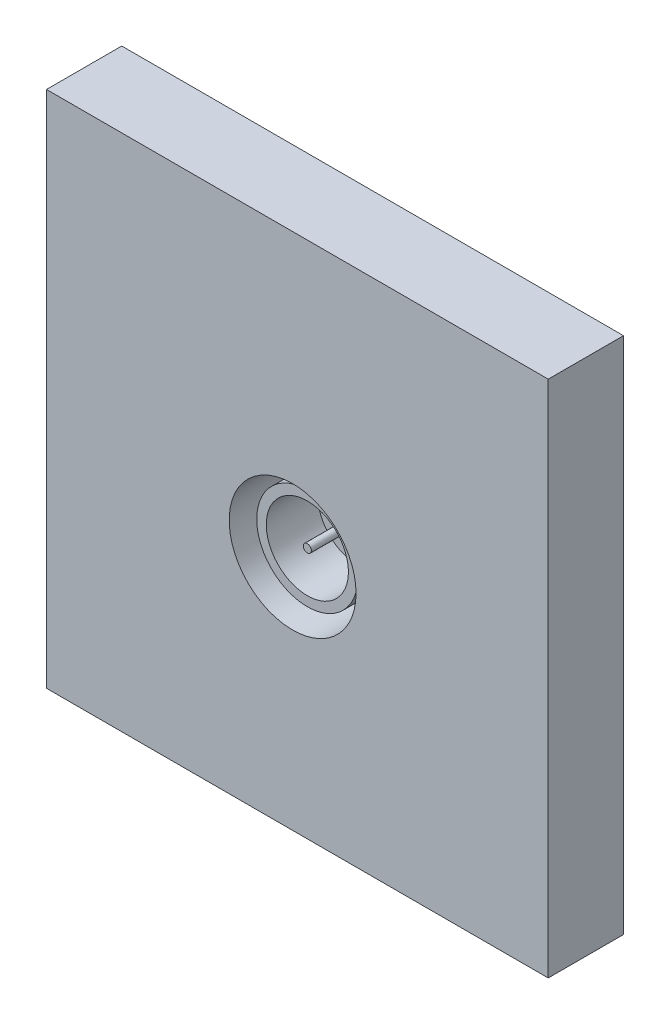
ISO-10303-21;
HEADER;
FILE_DESCRIPTION(('STEP AP214'),'2;1');
FILE_NAME('part.step','',(''),(''),'','','');
FILE_SCHEMA(('AUTOMOTIVE_DESIGN { 1 0 10303 214 1 1 1 1 }'));
ENDSEC;
DATA;
#1=APPLICATION_CONTEXT('core data for automotive mechanical design processes');
#2=APPLICATION_PROTOCOL_DEFINITION('international standard','automotive_design',2000,#1);
#3=PRODUCT_CONTEXT('',#1,'mechanical');
#4=PRODUCT('Part','Part','',(#3));
#5=PRODUCT_RELATED_PRODUCT_CATEGORY('part','',(#4));
#6=PRODUCT_DEFINITION_FORMATION('','',#4);
#7=PRODUCT_DEFINITION_CONTEXT('part definition',#1,'design');
#8=PRODUCT_DEFINITION('design','',#6,#7);
#9=PRODUCT_DEFINITION_SHAPE('','',#8);
#10=(LENGTH_UNIT() NAMED_UNIT(*) SI_UNIT(.MILLI.,.METRE.));
#11=(NAMED_UNIT(*) PLANE_ANGLE_UNIT() SI_UNIT($,.RADIAN.));
#12=(NAMED_UNIT(*) SI_UNIT($,.STERADIAN.) SOLID_ANGLE_UNIT());
#13=UNCERTAINTY_MEASURE_WITH_UNIT(LENGTH_MEASURE(1.E-05),#10,'distance_accuracy_value','');
#14=(GEOMETRIC_REPRESENTATION_CONTEXT(3) GLOBAL_UNCERTAINTY_ASSIGNED_CONTEXT((#13)) GLOBAL_UNIT_ASSIGNED_CONTEXT((#10,
#11,#12)) REPRESENTATION_CONTEXT('',''));
#15=CARTESIAN_POINT('',(0.,0.,0.));
#16=DIRECTION('',(0.,0.,1.));
#17=DIRECTION('',(1.,0.,0.));
#18=AXIS2_PLACEMENT_3D('',#15,#16,#17);
#19=CARTESIAN_POINT('',(-4329.,-6167.65165651162,943.51077616825));
#20=DIRECTION('',(0.,0.,1.));
#21=DIRECTION('',(1.,0.,0.));
#22=AXIS2_PLACEMENT_3D('',#19,#20,#21);
#23=PLANE('',#22);
#24=CARTESIAN_POINT('',(833.930631375601,-1197.16637306014,943.51077616825));
#25=DIRECTION('',(0.,0.,1.));
#26=DIRECTION('',(1.,0.,0.));
#27=AXIS2_PLACEMENT_3D('',#24,#25,#26);
#28=CIRCLE('',#27,1330.44932834744);
#29=CARTESIAN_POINT('',(2164.37995972304,-1197.16637306014,943.51077616825));
#30=VERTEX_POINT('',#29);
#31=EDGE_CURVE('E113',#30,#30,#28,.T.);
#32=ORIENTED_EDGE('',*,*,#31,.F.);
#33=EDGE_LOOP('',(#32));
#34=FACE_BOUND('',#33,.T.);
#35=DIRECTION('',(1.,0.,0.));
#36=VECTOR('',#35,1.);
#37=CARTESIAN_POINT('',(-4329.,-6167.65165651162,943.51077616825));
#38=LINE('',#37,#36);
#39=CARTESIAN_POINT('',(-4329.,-6167.65165651162,943.51077616825));
#40=VERTEX_POINT('',#39);
#41=CARTESIAN_POINT('',(6196.,-6167.65165651162,943.51077616825));
#42=VERTEX_POINT('',#41);
#43=EDGE_CURVE('E88',#40,#42,#38,.T.);
#44=ORIENTED_EDGE('',*,*,#43,.T.);
#45=DIRECTION('',(0.,-1.,0.));
#46=VECTOR('',#45,1.);
#47=CARTESIAN_POINT('',(6196.,-6167.65165651162,943.51077616825));
#48=LINE('',#47,#46);
#49=CARTESIAN_POINT('',(6196.,4711.30994980544,943.51077616825));
#50=VERTEX_POINT('',#49);
#51=EDGE_CURVE('E91',#50,#42,#48,.T.);
#52=ORIENTED_EDGE('',*,*,#51,.F.);
#53=DIRECTION('',(1.,0.,0.));
#54=VECTOR('',#53,1.);
#55=CARTESIAN_POINT('',(-4329.,4711.30994980544,943.51077616825));
#56=LINE('',#55,#54);
#57=CARTESIAN_POINT('',(-4329.,4711.30994980544,943.51077616825));
#58=VERTEX_POINT('',#57);
#59=EDGE_CURVE('E63',#58,#50,#56,.T.);
#60=ORIENTED_EDGE('',*,*,#59,.F.);
#61=DIRECTION('',(0.,-1.,0.));
#62=VECTOR('',#61,1.);
#63=CARTESIAN_POINT('',(-4329.,-6167.65165651162,943.51077616825));
#64=LINE('',#63,#62);
#65=EDGE_CURVE('E92',#58,#40,#64,.T.);
#66=ORIENTED_EDGE('',*,*,#65,.T.);
#67=EDGE_LOOP('',(#44,#52,#60,#66));
#68=FACE_BOUND('',#67,.T.);
#69=ADVANCED_FACE('F49',(#34,#68),#23,.T.);
#70=CARTESIAN_POINT('',(-4329.,4711.30994980544,943.51077616825));
#71=DIRECTION('',(0.,1.,0.));
#72=DIRECTION('',(0.,0.,1.));
#73=AXIS2_PLACEMENT_3D('',#70,#71,#72);
#74=PLANE('',#73);
#75=ORIENTED_EDGE('',*,*,#59,.T.);
#76=DIRECTION('',(0.,0.,1.));
#77=VECTOR('',#76,1.);
#78=CARTESIAN_POINT('',(6196.,4711.30994980544,943.51077616825));
#79=LINE('',#78,#77);
#80=CARTESIAN_POINT('',(6196.,4711.30994980544,-635.191200499874));
#81=VERTEX_POINT('',#80);
#82=EDGE_CURVE('E109',#81,#50,#79,.T.);
#83=ORIENTED_EDGE('',*,*,#82,.F.);
#84=DIRECTION('',(1.,0.,0.));
#85=VECTOR('',#84,1.);
#86=CARTESIAN_POINT('',(-4329.,4711.30994980544,-635.191200499874));
#87=LINE('',#86,#85);
#88=CARTESIAN_POINT('',(-4329.,4711.30994980544,-635.191200499874));
#89=VERTEX_POINT('',#88);
#90=EDGE_CURVE('E71',#89,#81,#87,.T.);
#91=ORIENTED_EDGE('',*,*,#90,.F.);
#92=DIRECTION('',(0.,0.,1.));
#93=VECTOR('',#92,1.);
#94=CARTESIAN_POINT('',(-4329.,4711.30994980544,943.51077616825));
#95=LINE('',#94,#93);
#96=EDGE_CURVE('E97',#89,#58,#95,.T.);
#97=ORIENTED_EDGE('',*,*,#96,.T.);
#98=EDGE_LOOP('',(#75,#83,#91,#97));
#99=FACE_BOUND('',#98,.T.);
#100=ADVANCED_FACE('F154',(#99),#74,.T.);
#101=CARTESIAN_POINT('',(-4329.,-6167.65165651162,-635.191200499874));
#102=DIRECTION('',(0.,0.,-1.));
#103=DIRECTION('',(0.,1.,0.));
#104=AXIS2_PLACEMENT_3D('',#101,#102,#103);
#105=PLANE('',#104);
#106=CARTESIAN_POINT('',(833.930631375601,-1197.16637306014,-635.191200499874));
#107=DIRECTION('',(0.,0.,-1.));
#108=DIRECTION('',(0.,1.,0.));
#109=AXIS2_PLACEMENT_3D('',#106,#107,#108);
#110=CIRCLE('',#109,1061.61577267249);
#111=CARTESIAN_POINT('',(833.930631375601,-135.550600387647,-635.191200499874));
#112=VERTEX_POINT('',#111);
#113=EDGE_CURVE('E173',#112,#112,#110,.T.);
#114=ORIENTED_EDGE('',*,*,#113,.F.);
#115=EDGE_LOOP('',(#114));
#116=FACE_BOUND('',#115,.T.);
#117=ORIENTED_EDGE('',*,*,#90,.T.);
#118=DIRECTION('',(0.,1.,0.));
#119=VECTOR('',#118,1.);
#120=CARTESIAN_POINT('',(6196.,-6167.65165651162,-635.191200499874));
#121=LINE('',#120,#119);
#122=CARTESIAN_POINT('',(6196.,-6167.65165651162,-635.191200499874));
#123=VERTEX_POINT('',#122);
#124=EDGE_CURVE('E105',#123,#81,#121,.T.);
#125=ORIENTED_EDGE('',*,*,#124,.F.);
#126=DIRECTION('',(1.,0.,0.));
#127=VECTOR('',#126,1.);
#128=CARTESIAN_POINT('',(-4329.,-6167.65165651162,-635.191200499874));
#129=LINE('',#128,#127);
#130=CARTESIAN_POINT('',(-4329.,-6167.65165651162,-635.191200499874));
#131=VERTEX_POINT('',#130);
#132=EDGE_CURVE('E96',#131,#123,#129,.T.);
#133=ORIENTED_EDGE('',*,*,#132,.F.);
#134=DIRECTION('',(0.,1.,0.));
#135=VECTOR('',#134,1.);
#136=CARTESIAN_POINT('',(-4329.,-6167.65165651162,-635.191200499874));
#137=LINE('',#136,#135);
#138=EDGE_CURVE('E122',#131,#89,#137,.T.);
#139=ORIENTED_EDGE('',*,*,#138,.T.);
#140=EDGE_LOOP('',(#117,#125,#133,#139));
#141=FACE_BOUND('',#140,.T.);
#142=ADVANCED_FACE('F139',(#116,#141),#105,.T.);
#143=CARTESIAN_POINT('',(-4329.,-6167.65165651162,943.51077616825));
#144=DIRECTION('',(0.,-1.,0.));
#145=DIRECTION('',(0.,0.,-1.));
#146=AXIS2_PLACEMENT_3D('',#143,#144,#145);
#147=PLANE('',#146);
#148=ORIENTED_EDGE('',*,*,#132,.T.);
#149=DIRECTION('',(0.,0.,-1.));
#150=VECTOR('',#149,1.);
#151=CARTESIAN_POINT('',(6196.,-6167.65165651162,943.51077616825));
#152=LINE('',#151,#150);
#153=EDGE_CURVE('E100',#42,#123,#152,.T.);
#154=ORIENTED_EDGE('',*,*,#153,.F.);
#155=ORIENTED_EDGE('',*,*,#43,.F.);
#156=DIRECTION('',(0.,0.,-1.));
#157=VECTOR('',#156,1.);
#158=CARTESIAN_POINT('',(-4329.,-6167.65165651162,943.51077616825));
#159=LINE('',#158,#157);
#160=EDGE_CURVE('E120',#40,#131,#159,.T.);
#161=ORIENTED_EDGE('',*,*,#160,.T.);
#162=EDGE_LOOP('',(#148,#154,#155,#161));
#163=FACE_BOUND('',#162,.T.);
#164=ADVANCED_FACE('F101',(#163),#147,.T.);
#165=CARTESIAN_POINT('',(-4329.,0.,0.));
#166=DIRECTION('',(-1.,0.,0.));
#167=DIRECTION('',(0.,0.,1.));
#168=AXIS2_PLACEMENT_3D('',#165,#166,#167);
#169=PLANE('',#168);
#170=ORIENTED_EDGE('',*,*,#65,.F.);
#171=ORIENTED_EDGE('',*,*,#96,.F.);
#172=ORIENTED_EDGE('',*,*,#138,.F.);
#173=ORIENTED_EDGE('',*,*,#160,.F.);
#174=EDGE_LOOP('',(#170,#171,#172,#173));
#175=FACE_BOUND('',#174,.T.);
#176=ADVANCED_FACE('F229',(#175),#169,.T.);
#177=CARTESIAN_POINT('',(6196.,0.,0.));
#178=DIRECTION('',(-1.,0.,0.));
#179=DIRECTION('',(0.,0.,1.));
#180=AXIS2_PLACEMENT_3D('',#177,#178,#179);
#181=PLANE('',#180);
#182=ORIENTED_EDGE('',*,*,#51,.T.);
#183=ORIENTED_EDGE('',*,*,#153,.T.);
#184=ORIENTED_EDGE('',*,*,#124,.T.);
#185=ORIENTED_EDGE('',*,*,#82,.T.);
#186=EDGE_LOOP('',(#182,#183,#184,#185));
#187=FACE_BOUND('',#186,.T.);
#188=ADVANCED_FACE('F108',(#187),#181,.F.);
#189=CARTESIAN_POINT('',(833.930631375601,-1197.16637306014,-440.489223831748));
#190=DIRECTION('',(0.,0.,1.));
#191=DIRECTION('',(1.,0.,0.));
#192=AXIS2_PLACEMENT_3D('',#189,#190,#191);
#193=CYLINDRICAL_SURFACE('',#192,1330.44932834744);
#194=CARTESIAN_POINT('',(833.930631375601,-1197.16637306014,-440.489223831748));
#195=DIRECTION('',(0.,0.,1.));
#196=DIRECTION('',(1.,0.,0.));
#197=AXIS2_PLACEMENT_3D('',#194,#195,#196);
#198=CIRCLE('',#197,1330.44932834744);
#199=CARTESIAN_POINT('',(2164.37995972304,-1197.16637306014,-440.489223831748));
#200=VERTEX_POINT('',#199);
#201=EDGE_CURVE('E110',#200,#200,#198,.T.);
#202=ORIENTED_EDGE('',*,*,#201,.F.);
#203=EDGE_LOOP('',(#202));
#204=FACE_BOUND('',#203,.T.);
#205=ORIENTED_EDGE('',*,*,#31,.T.);
#206=EDGE_LOOP('',(#205));
#207=FACE_BOUND('',#206,.T.);
#208=ADVANCED_FACE('F222',(#204,#207),#193,.F.);
#209=CARTESIAN_POINT('',(833.930631375601,-1197.16637306014,-440.489223831748));
#210=DIRECTION('',(0.,0.,1.));
#211=DIRECTION('',(1.,0.,0.));
#212=AXIS2_PLACEMENT_3D('',#209,#210,#211);
#213=PLANE('',#212);
#214=CARTESIAN_POINT('',(833.930631375601,-1197.16637306014,-440.489223831748));
#215=DIRECTION('',(0.,0.,1.));
#216=DIRECTION('',(1.,0.,0.));
#217=AXIS2_PLACEMENT_3D('',#214,#215,#216);
#218=CIRCLE('',#217,1061.61577267249);
#219=CARTESIAN_POINT('',(1895.54640404809,-1197.16637306014,-440.489223831748));
#220=VERTEX_POINT('',#219);
#221=EDGE_CURVE('E13',#220,#220,#218,.T.);
#222=ORIENTED_EDGE('',*,*,#221,.F.);
#223=EDGE_LOOP('',(#222));
#224=FACE_BOUND('',#223,.T.);
#225=ORIENTED_EDGE('',*,*,#201,.T.);
#226=EDGE_LOOP('',(#225));
#227=FACE_BOUND('',#226,.T.);
#228=ADVANCED_FACE('F208',(#224,#227),#213,.T.);
#229=CARTESIAN_POINT('',(833.930631375601,-1197.16637306014,-645.191200499874));
#230=DIRECTION('',(0.,0.,-1.));
#231=DIRECTION('',(0.,1.,0.));
#232=AXIS2_PLACEMENT_3D('',#229,#230,#231);
#233=PLANE('',#232);
#234=CARTESIAN_POINT('',(833.930631375601,-1197.16637306014,-645.191200499874));
#235=DIRECTION('',(0.,0.,-1.));
#236=DIRECTION('',(0.,1.,0.));
#237=AXIS2_PLACEMENT_3D('',#234,#235,#236);
#238=CIRCLE('',#237,1061.61577267249);
#239=CARTESIAN_POINT('',(833.930631375601,-135.550600387647,-645.191200499874));
#240=VERTEX_POINT('',#239);
#241=EDGE_CURVE('E168',#240,#240,#238,.T.);
#242=ORIENTED_EDGE('',*,*,#241,.T.);
#243=EDGE_LOOP('',(#242));
#244=FACE_BOUND('',#243,.T.);
#245=CARTESIAN_POINT('',(833.930631375601,-1197.16637306014,-645.191200499874));
#246=DIRECTION('',(0.,0.,-1.));
#247=DIRECTION('',(0.,1.,0.));
#248=AXIS2_PLACEMENT_3D('',#245,#246,#247);
#249=CIRCLE('',#248,861.273399978821);
#250=CARTESIAN_POINT('',(833.930631375601,-335.892973081319,-645.191200499874));
#251=VERTEX_POINT('',#250);
#252=EDGE_CURVE('E177',#251,#251,#249,.T.);
#253=ORIENTED_EDGE('',*,*,#252,.F.);
#254=EDGE_LOOP('',(#253));
#255=FACE_BOUND('',#254,.T.);
#256=ADVANCED_FACE('F205',(#244,#255),#233,.T.);
#257=CARTESIAN_POINT('',(833.930631375601,-1197.16637306014,-645.191200499874));
#258=DIRECTION('',(0.,0.,1.));
#259=DIRECTION('',(0.,-1.,0.));
#260=AXIS2_PLACEMENT_3D('',#257,#258,#259);
#261=CYLINDRICAL_SURFACE('',#260,1061.61577267249);
#262=ORIENTED_EDGE('',*,*,#241,.F.);
#263=EDGE_LOOP('',(#262));
#264=FACE_BOUND('',#263,.T.);
#265=ORIENTED_EDGE('',*,*,#113,.T.);
#266=EDGE_LOOP('',(#265));
#267=FACE_BOUND('',#266,.T.);
#268=ADVANCED_FACE('F149',(#264,#267),#261,.T.);
#269=CARTESIAN_POINT('',(833.930631375601,-1197.16637306014,-645.191200499874));
#270=DIRECTION('',(0.,0.,1.));
#271=DIRECTION('',(0.,-1.,0.));
#272=AXIS2_PLACEMENT_3D('',#269,#270,#271);
#273=CYLINDRICAL_SURFACE('',#272,861.273399978821);
#274=ORIENTED_EDGE('',*,*,#252,.T.);
#275=EDGE_LOOP('',(#274));
#276=FACE_BOUND('',#275,.T.);
#277=CARTESIAN_POINT('',(833.930631375601,-1197.16637306014,-635.191200499874));
#278=DIRECTION('',(0.,0.,-1.));
#279=DIRECTION('',(0.,1.,0.));
#280=AXIS2_PLACEMENT_3D('',#277,#278,#279);
#281=CIRCLE('',#280,861.273399978821);
#282=CARTESIAN_POINT('',(833.930631375601,-335.892973081319,-635.191200499874));
#283=VERTEX_POINT('',#282);
#284=EDGE_CURVE('E56',#283,#283,#281,.F.);
#285=ORIENTED_EDGE('',*,*,#284,.T.);
#286=EDGE_LOOP('',(#285));
#287=FACE_BOUND('',#286,.T.);
#288=ADVANCED_FACE('F133',(#276,#287),#273,.F.);
#289=ORIENTED_EDGE('',*,*,#284,.F.);
#290=EDGE_LOOP('',(#289));
#291=FACE_BOUND('',#290,.T.);
#292=ADVANCED_FACE('F135',(#291),#105,.T.);
#293=CARTESIAN_POINT('',(833.930631375601,-1197.16637306014,634.808799500127));
#294=DIRECTION('',(0.,0.,-1.));
#295=DIRECTION('',(0.,1.,0.));
#296=AXIS2_PLACEMENT_3D('',#293,#294,#295);
#297=CYLINDRICAL_SURFACE('',#296,861.273399978821);
#298=CARTESIAN_POINT('',(833.930631375601,-1197.16637306014,-440.489223831748));
#299=DIRECTION('',(0.,0.,1.));
#300=DIRECTION('',(1.,0.,0.));
#301=AXIS2_PLACEMENT_3D('',#298,#299,#300);
#302=CIRCLE('',#301,861.273399978821);
#303=CARTESIAN_POINT('',(1695.20403135442,-1197.16637306014,-440.489223831748));
#304=VERTEX_POINT('',#303);
#305=EDGE_CURVE('E181',#304,#304,#302,.T.);
#306=ORIENTED_EDGE('',*,*,#305,.F.);
#307=EDGE_LOOP('',(#306));
#308=FACE_BOUND('',#307,.T.);
#309=CARTESIAN_POINT('',(833.930631375601,-1197.16637306014,634.808799500127));
#310=DIRECTION('',(0.,0.,-1.));
#311=DIRECTION('',(0.,1.,0.));
#312=AXIS2_PLACEMENT_3D('',#309,#310,#311);
#313=CIRCLE('',#312,861.273399978821);
#314=CARTESIAN_POINT('',(833.930631375601,-335.892973081319,634.808799500127));
#315=VERTEX_POINT('',#314);
#316=EDGE_CURVE('E187',#315,#315,#313,.T.);
#317=ORIENTED_EDGE('',*,*,#316,.F.);
#318=EDGE_LOOP('',(#317));
#319=FACE_BOUND('',#318,.T.);
#320=ADVANCED_FACE('F137',(#308,#319),#297,.F.);
#321=CARTESIAN_POINT('',(833.930631375601,-1197.16637306014,634.808799500127));
#322=DIRECTION('',(0.,0.,-1.));
#323=DIRECTION('',(0.,1.,0.));
#324=AXIS2_PLACEMENT_3D('',#321,#322,#323);
#325=CYLINDRICAL_SURFACE('',#324,1061.61577267249);
#326=ORIENTED_EDGE('',*,*,#221,.T.);
#327=EDGE_LOOP('',(#326));
#328=FACE_BOUND('',#327,.T.);
#329=CARTESIAN_POINT('',(833.930631375601,-1197.16637306014,634.808799500127));
#330=DIRECTION('',(0.,0.,-1.));
#331=DIRECTION('',(0.,1.,0.));
#332=AXIS2_PLACEMENT_3D('',#329,#330,#331);
#333=CIRCLE('',#332,1061.61577267249);
#334=CARTESIAN_POINT('',(833.930631375601,-135.550600387647,634.808799500127));
#335=VERTEX_POINT('',#334);
#336=EDGE_CURVE('E184',#335,#335,#333,.T.);
#337=ORIENTED_EDGE('',*,*,#336,.T.);
#338=EDGE_LOOP('',(#337));
#339=FACE_BOUND('',#338,.T.);
#340=ADVANCED_FACE('F145',(#328,#339),#325,.T.);
#341=CARTESIAN_POINT('',(0.,0.,634.808799500127));
#342=DIRECTION('',(0.,0.,-1.));
#343=DIRECTION('',(0.,1.,0.));
#344=AXIS2_PLACEMENT_3D('',#341,#342,#343);
#345=PLANE('',#344);
#346=ORIENTED_EDGE('',*,*,#316,.T.);
#347=EDGE_LOOP('',(#346));
#348=FACE_BOUND('',#347,.T.);
#349=ORIENTED_EDGE('',*,*,#336,.F.);
#350=EDGE_LOOP('',(#349));
#351=FACE_BOUND('',#350,.T.);
#352=ADVANCED_FACE('F191',(#348,#351),#345,.F.);
#353=CARTESIAN_POINT('',(833.930631375601,-1197.16637306014,634.808799500124));
#354=DIRECTION('',(0.,0.,-1.));
#355=DIRECTION('',(0.,1.,0.));
#356=AXIS2_PLACEMENT_3D('',#353,#354,#355);
#357=PLANE('',#356);
#358=CARTESIAN_POINT('',(833.930631375601,-1197.16637306014,634.808799500124));
#359=DIRECTION('',(0.,0.,-1.));
#360=DIRECTION('',(0.,1.,0.));
#361=AXIS2_PLACEMENT_3D('',#358,#359,#360);
#362=CIRCLE('',#361,84.807211279212);
#363=CARTESIAN_POINT('',(833.930631375601,-1112.35916178093,634.808799500124));
#364=VERTEX_POINT('',#363);
#365=EDGE_CURVE('E166',#364,#364,#362,.T.);
#366=ORIENTED_EDGE('',*,*,#365,.F.);
#367=EDGE_LOOP('',(#366));
#368=FACE_BOUND('',#367,.T.);
#369=ADVANCED_FACE('F195',(#368),#357,.F.);
#370=CARTESIAN_POINT('',(833.930631375601,-1197.16637306014,634.808799500124));
#371=DIRECTION('',(0.,0.,-1.));
#372=DIRECTION('',(0.,1.,0.));
#373=AXIS2_PLACEMENT_3D('',#370,#371,#372);
#374=CYLINDRICAL_SURFACE('',#373,84.807211279212);
#375=CARTESIAN_POINT('',(833.930631375601,-1197.16637306014,-440.489223831748));
#376=DIRECTION('',(0.,0.,1.));
#377=DIRECTION('',(1.,0.,0.));
#378=AXIS2_PLACEMENT_3D('',#375,#376,#377);
#379=CIRCLE('',#378,84.807211279212);
#380=CARTESIAN_POINT('',(918.737842654813,-1197.16637306014,-440.489223831748));
#381=VERTEX_POINT('',#380);
#382=EDGE_CURVE('E126',#381,#381,#379,.T.);
#383=ORIENTED_EDGE('',*,*,#382,.T.);
#384=EDGE_LOOP('',(#383));
#385=FACE_BOUND('',#384,.T.);
#386=ORIENTED_EDGE('',*,*,#365,.T.);
#387=EDGE_LOOP('',(#386));
#388=FACE_BOUND('',#387,.T.);
#389=ADVANCED_FACE('F215',(#385,#388),#374,.T.);
#390=ORIENTED_EDGE('',*,*,#382,.F.);
#391=EDGE_LOOP('',(#390));
#392=FACE_BOUND('',#391,.T.);
#393=ORIENTED_EDGE('',*,*,#305,.T.);
#394=EDGE_LOOP('',(#393));
#395=FACE_BOUND('',#394,.T.);
#396=ADVANCED_FACE('F219',(#392,#395),#213,.T.);
#397=CLOSED_SHELL('',(#69,#100,#142,#164,#176,#188,#208,#228,#256,#268,#288,#292,#320,#340,#352,
#369,#389,#396));
#398=MANIFOLD_SOLID_BREP('B2',#397);
#399=ADVANCED_BREP_SHAPE_REPRESENTATION('',(#18,#398),#14);
#400=SHAPE_DEFINITION_REPRESENTATION(#9,#399);
ENDSEC;
END-ISO-10303-21;
